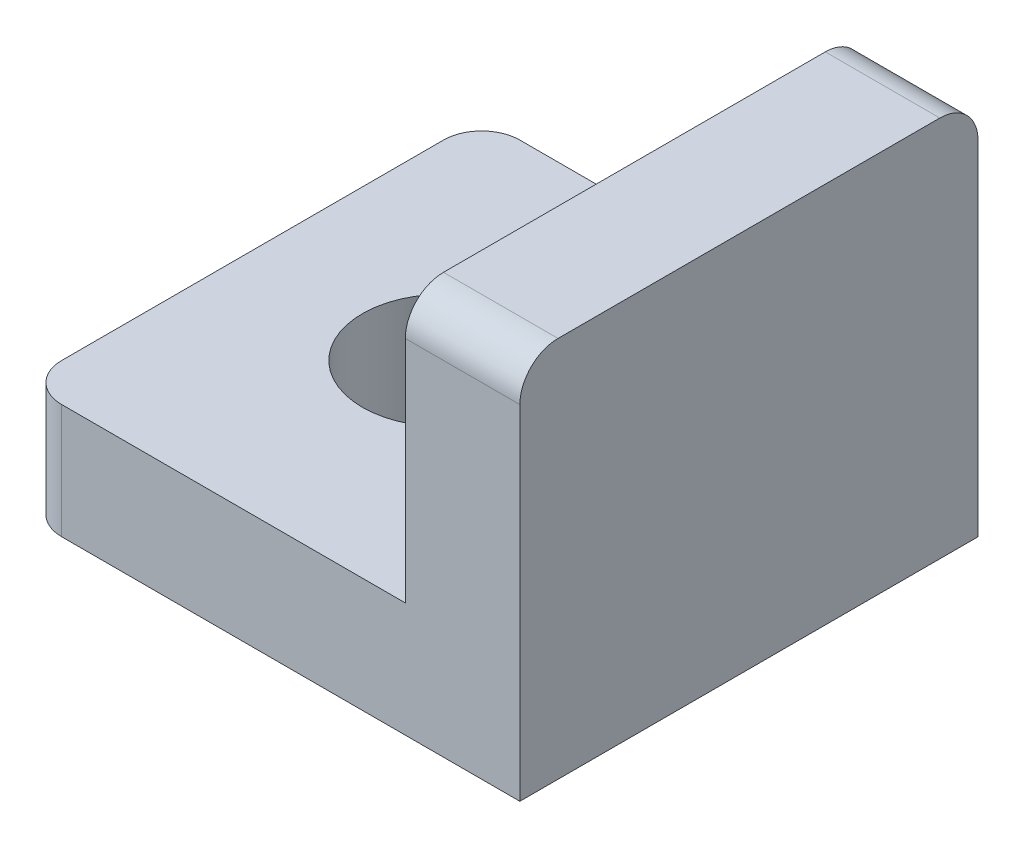
ISO-10303-21;
HEADER;
FILE_DESCRIPTION(('STEP AP214'),'2;1');
FILE_NAME('part.step','',(''),(''),'','','');
FILE_SCHEMA(('AUTOMOTIVE_DESIGN { 1 0 10303 214 1 1 1 1 }'));
ENDSEC;
DATA;
#1=APPLICATION_CONTEXT('core data for automotive mechanical design processes');
#2=APPLICATION_PROTOCOL_DEFINITION('international standard','automotive_design',2000,#1);
#3=PRODUCT_CONTEXT('',#1,'mechanical');
#4=PRODUCT('Part','Part','',(#3));
#5=PRODUCT_RELATED_PRODUCT_CATEGORY('part','',(#4));
#6=PRODUCT_DEFINITION_FORMATION('','',#4);
#7=PRODUCT_DEFINITION_CONTEXT('part definition',#1,'design');
#8=PRODUCT_DEFINITION('design','',#6,#7);
#9=PRODUCT_DEFINITION_SHAPE('','',#8);
#10=(LENGTH_UNIT() NAMED_UNIT(*) SI_UNIT(.MILLI.,.METRE.));
#11=(NAMED_UNIT(*) PLANE_ANGLE_UNIT() SI_UNIT($,.RADIAN.));
#12=(NAMED_UNIT(*) SI_UNIT($,.STERADIAN.) SOLID_ANGLE_UNIT());
#13=UNCERTAINTY_MEASURE_WITH_UNIT(LENGTH_MEASURE(1.E-05),#10,'distance_accuracy_value','');
#14=(GEOMETRIC_REPRESENTATION_CONTEXT(3) GLOBAL_UNCERTAINTY_ASSIGNED_CONTEXT((#13)) GLOBAL_UNIT_ASSIGNED_CONTEXT((#10,
#11,#12)) REPRESENTATION_CONTEXT('',''));
#15=CARTESIAN_POINT('',(0.,0.,0.));
#16=DIRECTION('',(0.,0.,1.));
#17=DIRECTION('',(1.,0.,0.));
#18=AXIS2_PLACEMENT_3D('',#15,#16,#17);
#19=CARTESIAN_POINT('',(-5.,10.,6.));
#20=DIRECTION('',(1.,0.,0.));
#21=DIRECTION('',(0.,0.,-1.));
#22=AXIS2_PLACEMENT_3D('',#19,#20,#21);
#23=PLANE('',#22);
#24=DIRECTION('',(0.,0.,1.));
#25=VECTOR('',#24,1.);
#26=CARTESIAN_POINT('',(-5.,0.,6.));
#27=LINE('',#26,#25);
#28=CARTESIAN_POINT('',(-5.,0.,-5.));
#29=VERTEX_POINT('',#28);
#30=CARTESIAN_POINT('',(-5.,0.,5.));
#31=VERTEX_POINT('',#30);
#32=EDGE_CURVE('E158',#29,#31,#27,.T.);
#33=ORIENTED_EDGE('',*,*,#32,.T.);
#34=DIRECTION('',(0.,-1.,0.));
#35=VECTOR('',#34,1.);
#36=CARTESIAN_POINT('',(-5.,10.,5.));
#37=LINE('',#36,#35);
#38=CARTESIAN_POINT('',(-5.,3.,5.));
#39=VERTEX_POINT('',#38);
#40=EDGE_CURVE('E200',#31,#39,#37,.F.);
#41=ORIENTED_EDGE('',*,*,#40,.T.);
#42=DIRECTION('',(0.,0.,1.));
#43=VECTOR('',#42,1.);
#44=CARTESIAN_POINT('',(-5.,3.,6.));
#45=LINE('',#44,#43);
#46=CARTESIAN_POINT('',(-5.,3.,-5.));
#47=VERTEX_POINT('',#46);
#48=EDGE_CURVE('E151',#47,#39,#45,.T.);
#49=ORIENTED_EDGE('',*,*,#48,.F.);
#50=DIRECTION('',(0.,-1.,0.));
#51=VECTOR('',#50,1.);
#52=CARTESIAN_POINT('',(-5.,10.,-5.));
#53=LINE('',#52,#51);
#54=EDGE_CURVE('E196',#47,#29,#53,.T.);
#55=ORIENTED_EDGE('',*,*,#54,.T.);
#56=EDGE_LOOP('',(#33,#41,#49,#55));
#57=FACE_BOUND('',#56,.T.);
#58=ADVANCED_FACE('F39',(#57),#23,.F.);
#59=CARTESIAN_POINT('',(8.,10.,6.));
#60=DIRECTION('',(0.,0.,-1.));
#61=DIRECTION('',(-1.,0.,0.));
#62=AXIS2_PLACEMENT_3D('',#59,#60,#61);
#63=PLANE('',#62);
#64=DIRECTION('',(1.,0.,0.));
#65=VECTOR('',#64,1.);
#66=CARTESIAN_POINT('',(8.,3.,6.));
#67=LINE('',#66,#65);
#68=CARTESIAN_POINT('',(-4.,3.,6.));
#69=VERTEX_POINT('',#68);
#70=CARTESIAN_POINT('',(5.,3.,6.));
#71=VERTEX_POINT('',#70);
#72=EDGE_CURVE('E139',#69,#71,#67,.T.);
#73=ORIENTED_EDGE('',*,*,#72,.F.);
#74=DIRECTION('',(0.,-1.,0.));
#75=VECTOR('',#74,1.);
#76=CARTESIAN_POINT('',(-4.,10.,6.));
#77=LINE('',#76,#75);
#78=CARTESIAN_POINT('',(-4.,0.,6.));
#79=VERTEX_POINT('',#78);
#80=EDGE_CURVE('E186',#69,#79,#77,.T.);
#81=ORIENTED_EDGE('',*,*,#80,.T.);
#82=DIRECTION('',(1.,0.,0.));
#83=VECTOR('',#82,1.);
#84=CARTESIAN_POINT('',(8.,0.,6.));
#85=LINE('',#84,#83);
#86=CARTESIAN_POINT('',(8.,0.,6.));
#87=VERTEX_POINT('',#86);
#88=EDGE_CURVE('E168',#79,#87,#85,.T.);
#89=ORIENTED_EDGE('',*,*,#88,.T.);
#90=DIRECTION('',(0.,-1.,0.));
#91=VECTOR('',#90,1.);
#92=CARTESIAN_POINT('',(8.,10.,6.));
#93=LINE('',#92,#91);
#94=CARTESIAN_POINT('',(8.,9.,6.));
#95=VERTEX_POINT('',#94);
#96=EDGE_CURVE('E180',#95,#87,#93,.T.);
#97=ORIENTED_EDGE('',*,*,#96,.F.);
#98=DIRECTION('',(1.,0.,0.));
#99=VECTOR('',#98,1.);
#100=CARTESIAN_POINT('',(5.,9.,6.));
#101=LINE('',#100,#99);
#102=CARTESIAN_POINT('',(5.,9.,6.));
#103=VERTEX_POINT('',#102);
#104=EDGE_CURVE('E183',#95,#103,#101,.F.);
#105=ORIENTED_EDGE('',*,*,#104,.T.);
#106=DIRECTION('',(0.,-1.,0.));
#107=VECTOR('',#106,1.);
#108=CARTESIAN_POINT('',(5.,10.,6.));
#109=LINE('',#108,#107);
#110=EDGE_CURVE('E128',#103,#71,#109,.T.);
#111=ORIENTED_EDGE('',*,*,#110,.T.);
#112=EDGE_LOOP('',(#73,#81,#89,#97,#105,#111));
#113=FACE_BOUND('',#112,.T.);
#114=ADVANCED_FACE('F229',(#113),#63,.F.);
#115=CARTESIAN_POINT('',(8.,10.,-6.));
#116=DIRECTION('',(0.,0.,1.));
#117=DIRECTION('',(1.,0.,0.));
#118=AXIS2_PLACEMENT_3D('',#115,#116,#117);
#119=PLANE('',#118);
#120=DIRECTION('',(-1.,0.,0.));
#121=VECTOR('',#120,1.);
#122=CARTESIAN_POINT('',(8.,0.,-6.));
#123=LINE('',#122,#121);
#124=CARTESIAN_POINT('',(8.,0.,-6.));
#125=VERTEX_POINT('',#124);
#126=CARTESIAN_POINT('',(-4.,0.,-6.));
#127=VERTEX_POINT('',#126);
#128=EDGE_CURVE('E164',#125,#127,#123,.T.);
#129=ORIENTED_EDGE('',*,*,#128,.T.);
#130=DIRECTION('',(0.,-1.,0.));
#131=VECTOR('',#130,1.);
#132=CARTESIAN_POINT('',(-4.,10.,-6.));
#133=LINE('',#132,#131);
#134=CARTESIAN_POINT('',(-4.,3.,-6.));
#135=VERTEX_POINT('',#134);
#136=EDGE_CURVE('E145',#127,#135,#133,.F.);
#137=ORIENTED_EDGE('',*,*,#136,.T.);
#138=DIRECTION('',(-1.,0.,0.));
#139=VECTOR('',#138,1.);
#140=CARTESIAN_POINT('',(8.,3.,-6.));
#141=LINE('',#140,#139);
#142=CARTESIAN_POINT('',(5.,3.,-6.));
#143=VERTEX_POINT('',#142);
#144=EDGE_CURVE('E136',#143,#135,#141,.T.);
#145=ORIENTED_EDGE('',*,*,#144,.F.);
#146=DIRECTION('',(0.,-1.,0.));
#147=VECTOR('',#146,1.);
#148=CARTESIAN_POINT('',(5.,10.,-6.));
#149=LINE('',#148,#147);
#150=CARTESIAN_POINT('',(5.,9.,-6.));
#151=VERTEX_POINT('',#150);
#152=EDGE_CURVE('E117',#151,#143,#149,.T.);
#153=ORIENTED_EDGE('',*,*,#152,.F.);
#154=DIRECTION('',(-1.,0.,0.));
#155=VECTOR('',#154,1.);
#156=CARTESIAN_POINT('',(8.,9.,-6.));
#157=LINE('',#156,#155);
#158=CARTESIAN_POINT('',(8.,9.,-6.));
#159=VERTEX_POINT('',#158);
#160=EDGE_CURVE('E209',#151,#159,#157,.F.);
#161=ORIENTED_EDGE('',*,*,#160,.T.);
#162=DIRECTION('',(0.,-1.,0.));
#163=VECTOR('',#162,1.);
#164=CARTESIAN_POINT('',(8.,10.,-6.));
#165=LINE('',#164,#163);
#166=EDGE_CURVE('E163',#159,#125,#165,.T.);
#167=ORIENTED_EDGE('',*,*,#166,.T.);
#168=EDGE_LOOP('',(#129,#137,#145,#153,#161,#167));
#169=FACE_BOUND('',#168,.T.);
#170=ADVANCED_FACE('F143',(#169),#119,.F.);
#171=CARTESIAN_POINT('',(8.,10.,6.));
#172=DIRECTION('',(-1.,0.,0.));
#173=DIRECTION('',(0.,0.,1.));
#174=AXIS2_PLACEMENT_3D('',#171,#172,#173);
#175=PLANE('',#174);
#176=ORIENTED_EDGE('',*,*,#166,.F.);
#177=CARTESIAN_POINT('',(8.,9.,-5.));
#178=DIRECTION('',(-1.,0.,0.));
#179=DIRECTION('',(0.,0.,1.));
#180=AXIS2_PLACEMENT_3D('',#177,#178,#179);
#181=CIRCLE('',#180,1.);
#182=CARTESIAN_POINT('',(8.,10.,-5.));
#183=VERTEX_POINT('',#182);
#184=EDGE_CURVE('E11',#159,#183,#181,.F.);
#185=ORIENTED_EDGE('',*,*,#184,.T.);
#186=DIRECTION('',(0.,0.,-1.));
#187=VECTOR('',#186,1.);
#188=CARTESIAN_POINT('',(8.,10.,6.));
#189=LINE('',#188,#187);
#190=CARTESIAN_POINT('',(8.,10.,5.));
#191=VERTEX_POINT('',#190);
#192=EDGE_CURVE('E160',#191,#183,#189,.T.);
#193=ORIENTED_EDGE('',*,*,#192,.F.);
#194=CARTESIAN_POINT('',(8.,9.,5.));
#195=DIRECTION('',(-1.,0.,0.));
#196=DIRECTION('',(0.,0.,1.));
#197=AXIS2_PLACEMENT_3D('',#194,#195,#196);
#198=CIRCLE('',#197,1.);
#199=EDGE_CURVE('E48',#191,#95,#198,.F.);
#200=ORIENTED_EDGE('',*,*,#199,.T.);
#201=ORIENTED_EDGE('',*,*,#96,.T.);
#202=DIRECTION('',(0.,0.,-1.));
#203=VECTOR('',#202,1.);
#204=CARTESIAN_POINT('',(8.,0.,6.));
#205=LINE('',#204,#203);
#206=EDGE_CURVE('E172',#87,#125,#205,.T.);
#207=ORIENTED_EDGE('',*,*,#206,.T.);
#208=EDGE_LOOP('',(#176,#185,#193,#200,#201,#207));
#209=FACE_BOUND('',#208,.T.);
#210=ADVANCED_FACE('F227',(#209),#175,.F.);
#211=CARTESIAN_POINT('',(0.,10.,0.));
#212=DIRECTION('',(0.,1.,0.));
#213=DIRECTION('',(0.,0.,1.));
#214=AXIS2_PLACEMENT_3D('',#211,#212,#213);
#215=PLANE('',#214);
#216=ORIENTED_EDGE('',*,*,#192,.T.);
#217=DIRECTION('',(-1.,0.,0.));
#218=VECTOR('',#217,1.);
#219=CARTESIAN_POINT('',(5.,10.,-5.));
#220=LINE('',#219,#218);
#221=CARTESIAN_POINT('',(5.,10.,-5.));
#222=VERTEX_POINT('',#221);
#223=EDGE_CURVE('E217',#183,#222,#220,.T.);
#224=ORIENTED_EDGE('',*,*,#223,.T.);
#225=DIRECTION('',(0.,0.,-1.));
#226=VECTOR('',#225,1.);
#227=CARTESIAN_POINT('',(5.,10.,6.));
#228=LINE('',#227,#226);
#229=CARTESIAN_POINT('',(5.,10.,5.));
#230=VERTEX_POINT('',#229);
#231=EDGE_CURVE('E129',#230,#222,#228,.T.);
#232=ORIENTED_EDGE('',*,*,#231,.F.);
#233=DIRECTION('',(1.,0.,0.));
#234=VECTOR('',#233,1.);
#235=CARTESIAN_POINT('',(8.,10.,5.));
#236=LINE('',#235,#234);
#237=EDGE_CURVE('E214',#230,#191,#236,.T.);
#238=ORIENTED_EDGE('',*,*,#237,.T.);
#239=EDGE_LOOP('',(#216,#224,#232,#238));
#240=FACE_BOUND('',#239,.T.);
#241=ADVANCED_FACE('F235',(#240),#215,.T.);
#242=CARTESIAN_POINT('',(0.,0.,0.));
#243=DIRECTION('',(0.,1.,0.));
#244=DIRECTION('',(0.,0.,1.));
#245=AXIS2_PLACEMENT_3D('',#242,#243,#244);
#246=PLANE('',#245);
#247=CARTESIAN_POINT('',(0.,0.,0.));
#248=DIRECTION('',(0.,1.,0.));
#249=DIRECTION('',(0.,0.,1.));
#250=AXIS2_PLACEMENT_3D('',#247,#248,#249);
#251=CIRCLE('',#250,2.125);
#252=CARTESIAN_POINT('',(0.,0.,2.125));
#253=VERTEX_POINT('',#252);
#254=EDGE_CURVE('E154',#253,#253,#251,.T.);
#255=ORIENTED_EDGE('',*,*,#254,.T.);
#256=EDGE_LOOP('',(#255));
#257=FACE_BOUND('',#256,.T.);
#258=ORIENTED_EDGE('',*,*,#88,.F.);
#259=CARTESIAN_POINT('',(-4.,0.,5.));
#260=DIRECTION('',(0.,1.,0.));
#261=DIRECTION('',(0.,0.,1.));
#262=AXIS2_PLACEMENT_3D('',#259,#260,#261);
#263=CIRCLE('',#262,1.);
#264=EDGE_CURVE('E193',#79,#31,#263,.F.);
#265=ORIENTED_EDGE('',*,*,#264,.T.);
#266=ORIENTED_EDGE('',*,*,#32,.F.);
#267=CARTESIAN_POINT('',(-4.,0.,-5.));
#268=DIRECTION('',(0.,1.,0.));
#269=DIRECTION('',(0.,0.,1.));
#270=AXIS2_PLACEMENT_3D('',#267,#268,#269);
#271=CIRCLE('',#270,1.);
#272=EDGE_CURVE('E190',#29,#127,#271,.F.);
#273=ORIENTED_EDGE('',*,*,#272,.T.);
#274=ORIENTED_EDGE('',*,*,#128,.F.);
#275=ORIENTED_EDGE('',*,*,#206,.F.);
#276=EDGE_LOOP('',(#258,#265,#266,#273,#274,#275));
#277=FACE_BOUND('',#276,.T.);
#278=ADVANCED_FACE('F241',(#257,#277),#246,.F.);
#279=CARTESIAN_POINT('',(5.,10.,6.));
#280=DIRECTION('',(-1.,0.,0.));
#281=DIRECTION('',(0.,0.,1.));
#282=AXIS2_PLACEMENT_3D('',#279,#280,#281);
#283=PLANE('',#282);
#284=CARTESIAN_POINT('',(5.,6.5,0.));
#285=DIRECTION('',(1.,0.,0.));
#286=DIRECTION('',(0.,0.,-1.));
#287=AXIS2_PLACEMENT_3D('',#284,#285,#286);
#288=CIRCLE('',#287,2.625);
#289=CARTESIAN_POINT('',(5.,6.5,-2.625));
#290=VERTEX_POINT('',#289);
#291=EDGE_CURVE('E300',#290,#290,#288,.T.);
#292=ORIENTED_EDGE('',*,*,#291,.T.);
#293=EDGE_LOOP('',(#292));
#294=FACE_BOUND('',#293,.T.);
#295=ORIENTED_EDGE('',*,*,#231,.T.);
#296=CARTESIAN_POINT('',(5.,9.,-5.));
#297=DIRECTION('',(-1.,0.,0.));
#298=DIRECTION('',(0.,0.,1.));
#299=AXIS2_PLACEMENT_3D('',#296,#297,#298);
#300=CIRCLE('',#299,1.);
#301=EDGE_CURVE('E123',#222,#151,#300,.T.);
#302=ORIENTED_EDGE('',*,*,#301,.T.);
#303=ORIENTED_EDGE('',*,*,#152,.T.);
#304=DIRECTION('',(0.,0.,-1.));
#305=VECTOR('',#304,1.);
#306=CARTESIAN_POINT('',(5.,3.,6.));
#307=LINE('',#306,#305);
#308=EDGE_CURVE('E122',#71,#143,#307,.T.);
#309=ORIENTED_EDGE('',*,*,#308,.F.);
#310=ORIENTED_EDGE('',*,*,#110,.F.);
#311=CARTESIAN_POINT('',(5.,9.,5.));
#312=DIRECTION('',(-1.,0.,0.));
#313=DIRECTION('',(0.,0.,1.));
#314=AXIS2_PLACEMENT_3D('',#311,#312,#313);
#315=CIRCLE('',#314,1.);
#316=EDGE_CURVE('E221',#103,#230,#315,.T.);
#317=ORIENTED_EDGE('',*,*,#316,.T.);
#318=EDGE_LOOP('',(#295,#302,#303,#309,#310,#317));
#319=FACE_BOUND('',#318,.T.);
#320=ADVANCED_FACE('F120',(#294,#319),#283,.T.);
#321=CARTESIAN_POINT('',(0.,3.,0.));
#322=DIRECTION('',(0.,1.,0.));
#323=DIRECTION('',(0.,0.,1.));
#324=AXIS2_PLACEMENT_3D('',#321,#322,#323);
#325=PLANE('',#324);
#326=CARTESIAN_POINT('',(0.,3.,0.));
#327=DIRECTION('',(0.,1.,0.));
#328=DIRECTION('',(0.,0.,1.));
#329=AXIS2_PLACEMENT_3D('',#326,#327,#328);
#330=CIRCLE('',#329,2.125);
#331=CARTESIAN_POINT('',(0.,3.,2.125));
#332=VERTEX_POINT('',#331);
#333=EDGE_CURVE('E304',#332,#332,#330,.T.);
#334=ORIENTED_EDGE('',*,*,#333,.F.);
#335=EDGE_LOOP('',(#334));
#336=FACE_BOUND('',#335,.T.);
#337=ORIENTED_EDGE('',*,*,#48,.T.);
#338=CARTESIAN_POINT('',(-4.,3.,5.));
#339=DIRECTION('',(0.,1.,0.));
#340=DIRECTION('',(0.,0.,1.));
#341=AXIS2_PLACEMENT_3D('',#338,#339,#340);
#342=CIRCLE('',#341,1.);
#343=EDGE_CURVE('E206',#39,#69,#342,.T.);
#344=ORIENTED_EDGE('',*,*,#343,.T.);
#345=ORIENTED_EDGE('',*,*,#72,.T.);
#346=ORIENTED_EDGE('',*,*,#308,.T.);
#347=ORIENTED_EDGE('',*,*,#144,.T.);
#348=CARTESIAN_POINT('',(-4.,3.,-5.));
#349=DIRECTION('',(0.,1.,0.));
#350=DIRECTION('',(0.,0.,1.));
#351=AXIS2_PLACEMENT_3D('',#348,#349,#350);
#352=CIRCLE('',#351,1.);
#353=EDGE_CURVE('E203',#135,#47,#352,.T.);
#354=ORIENTED_EDGE('',*,*,#353,.T.);
#355=EDGE_LOOP('',(#337,#344,#345,#346,#347,#354));
#356=FACE_BOUND('',#355,.T.);
#357=ADVANCED_FACE('F135',(#336,#356),#325,.T.);
#358=CARTESIAN_POINT('',(0.,0.,0.));
#359=DIRECTION('',(0.,1.,0.));
#360=DIRECTION('',(0.,0.,1.));
#361=AXIS2_PLACEMENT_3D('',#358,#359,#360);
#362=CYLINDRICAL_SURFACE('',#361,2.125);
#363=ORIENTED_EDGE('',*,*,#254,.F.);
#364=EDGE_LOOP('',(#363));
#365=FACE_BOUND('',#364,.T.);
#366=ORIENTED_EDGE('',*,*,#333,.T.);
#367=EDGE_LOOP('',(#366));
#368=FACE_BOUND('',#367,.T.);
#369=ADVANCED_FACE('F282',(#365,#368),#362,.F.);
#370=CARTESIAN_POINT('',(7.5,6.5,0.));
#371=DIRECTION('',(-1.,0.,0.));
#372=DIRECTION('',(0.,0.,1.));
#373=AXIS2_PLACEMENT_3D('',#370,#371,#372);
#374=CYLINDRICAL_SURFACE('',#373,2.625);
#375=CARTESIAN_POINT('',(7.5,6.5,0.));
#376=DIRECTION('',(1.,0.,0.));
#377=DIRECTION('',(0.,0.,-1.));
#378=AXIS2_PLACEMENT_3D('',#375,#376,#377);
#379=CIRCLE('',#378,2.625);
#380=CARTESIAN_POINT('',(7.5,6.5,-2.625));
#381=VERTEX_POINT('',#380);
#382=EDGE_CURVE('E297',#381,#381,#379,.T.);
#383=ORIENTED_EDGE('',*,*,#382,.T.);
#384=EDGE_LOOP('',(#383));
#385=FACE_BOUND('',#384,.T.);
#386=ORIENTED_EDGE('',*,*,#291,.F.);
#387=EDGE_LOOP('',(#386));
#388=FACE_BOUND('',#387,.T.);
#389=ADVANCED_FACE('F261',(#385,#388),#374,.F.);
#390=CARTESIAN_POINT('',(7.5,6.5,0.));
#391=DIRECTION('',(1.,0.,0.));
#392=DIRECTION('',(0.,0.,-1.));
#393=AXIS2_PLACEMENT_3D('',#390,#391,#392);
#394=PLANE('',#393);
#395=ORIENTED_EDGE('',*,*,#382,.F.);
#396=EDGE_LOOP('',(#395));
#397=FACE_BOUND('',#396,.T.);
#398=ADVANCED_FACE('F254',(#397),#394,.F.);
#399=CARTESIAN_POINT('',(-4.,10.,5.));
#400=DIRECTION('',(0.,-1.,0.));
#401=DIRECTION('',(0.,0.,-1.));
#402=AXIS2_PLACEMENT_3D('',#399,#400,#401);
#403=CYLINDRICAL_SURFACE('',#402,1.);
#404=ORIENTED_EDGE('',*,*,#343,.F.);
#405=ORIENTED_EDGE('',*,*,#40,.F.);
#406=ORIENTED_EDGE('',*,*,#264,.F.);
#407=ORIENTED_EDGE('',*,*,#80,.F.);
#408=EDGE_LOOP('',(#404,#405,#406,#407));
#409=FACE_BOUND('',#408,.T.);
#410=ADVANCED_FACE('F251',(#409),#403,.T.);
#411=CARTESIAN_POINT('',(-4.,10.,-5.));
#412=DIRECTION('',(0.,-1.,0.));
#413=DIRECTION('',(0.,0.,-1.));
#414=AXIS2_PLACEMENT_3D('',#411,#412,#413);
#415=CYLINDRICAL_SURFACE('',#414,1.);
#416=ORIENTED_EDGE('',*,*,#353,.F.);
#417=ORIENTED_EDGE('',*,*,#136,.F.);
#418=ORIENTED_EDGE('',*,*,#272,.F.);
#419=ORIENTED_EDGE('',*,*,#54,.F.);
#420=EDGE_LOOP('',(#416,#417,#418,#419));
#421=FACE_BOUND('',#420,.T.);
#422=ADVANCED_FACE('F244',(#421),#415,.T.);
#423=CARTESIAN_POINT('',(0.,9.,-5.));
#424=DIRECTION('',(1.,0.,0.));
#425=DIRECTION('',(0.,0.,-1.));
#426=AXIS2_PLACEMENT_3D('',#423,#424,#425);
#427=CYLINDRICAL_SURFACE('',#426,1.);
#428=ORIENTED_EDGE('',*,*,#184,.F.);
#429=ORIENTED_EDGE('',*,*,#160,.F.);
#430=ORIENTED_EDGE('',*,*,#301,.F.);
#431=ORIENTED_EDGE('',*,*,#223,.F.);
#432=EDGE_LOOP('',(#428,#429,#430,#431));
#433=FACE_BOUND('',#432,.T.);
#434=ADVANCED_FACE('F238',(#433),#427,.T.);
#435=CARTESIAN_POINT('',(0.,9.,5.));
#436=DIRECTION('',(-1.,0.,0.));
#437=DIRECTION('',(0.,0.,1.));
#438=AXIS2_PLACEMENT_3D('',#435,#436,#437);
#439=CYLINDRICAL_SURFACE('',#438,1.);
#440=ORIENTED_EDGE('',*,*,#316,.F.);
#441=ORIENTED_EDGE('',*,*,#104,.F.);
#442=ORIENTED_EDGE('',*,*,#199,.F.);
#443=ORIENTED_EDGE('',*,*,#237,.F.);
#444=EDGE_LOOP('',(#440,#441,#442,#443));
#445=FACE_BOUND('',#444,.T.);
#446=ADVANCED_FACE('F41',(#445),#439,.T.);
#447=CLOSED_SHELL('',(#58,#114,#170,#210,#241,#278,#320,#357,#369,#389,#398,#410,#422,#434,#446));
#448=MANIFOLD_SOLID_BREP('B2',#447);
#449=ADVANCED_BREP_SHAPE_REPRESENTATION('',(#18,#448),#14);
#450=SHAPE_DEFINITION_REPRESENTATION(#9,#449);
ENDSEC;
END-ISO-10303-21;
